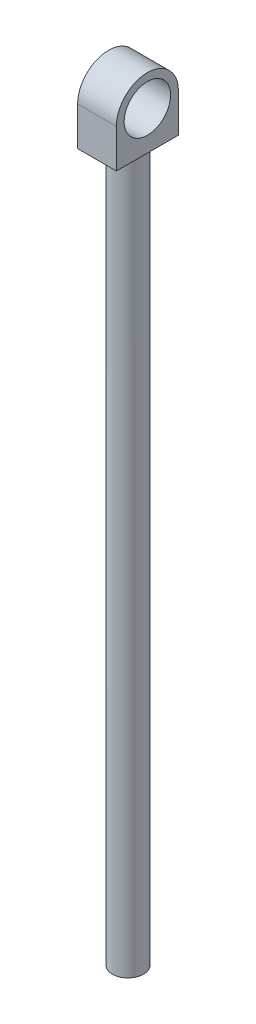
ISO-10303-21;
HEADER;
FILE_DESCRIPTION(('STEP AP214'),'2;1');
FILE_NAME('part.step','',(''),(''),'','','');
FILE_SCHEMA(('AUTOMOTIVE_DESIGN { 1 0 10303 214 1 1 1 1 }'));
ENDSEC;
DATA;
#1=APPLICATION_CONTEXT('core data for automotive mechanical design processes');
#2=APPLICATION_PROTOCOL_DEFINITION('international standard','automotive_design',2000,#1);
#3=PRODUCT_CONTEXT('',#1,'mechanical');
#4=PRODUCT('Part','Part','',(#3));
#5=PRODUCT_RELATED_PRODUCT_CATEGORY('part','',(#4));
#6=PRODUCT_DEFINITION_FORMATION('','',#4);
#7=PRODUCT_DEFINITION_CONTEXT('part definition',#1,'design');
#8=PRODUCT_DEFINITION('design','',#6,#7);
#9=PRODUCT_DEFINITION_SHAPE('','',#8);
#10=(LENGTH_UNIT() NAMED_UNIT(*) SI_UNIT(.MILLI.,.METRE.));
#11=(NAMED_UNIT(*) PLANE_ANGLE_UNIT() SI_UNIT($,.RADIAN.));
#12=(NAMED_UNIT(*) SI_UNIT($,.STERADIAN.) SOLID_ANGLE_UNIT());
#13=UNCERTAINTY_MEASURE_WITH_UNIT(LENGTH_MEASURE(1.E-05),#10,'distance_accuracy_value','');
#14=(GEOMETRIC_REPRESENTATION_CONTEXT(3) GLOBAL_UNCERTAINTY_ASSIGNED_CONTEXT((#13)) GLOBAL_UNIT_ASSIGNED_CONTEXT((#10,
#11,#12)) REPRESENTATION_CONTEXT('',''));
#15=CARTESIAN_POINT('',(0.,0.,0.));
#16=DIRECTION('',(0.,0.,1.));
#17=DIRECTION('',(1.,0.,0.));
#18=AXIS2_PLACEMENT_3D('',#15,#16,#17);
#19=CARTESIAN_POINT('',(0.,60.,0.));
#20=DIRECTION('',(0.,-1.,0.));
#21=DIRECTION('',(0.,0.,-1.));
#22=AXIS2_PLACEMENT_3D('',#19,#20,#21);
#23=CYLINDRICAL_SURFACE('',#22,2.);
#24=CARTESIAN_POINT('',(0.,60.,0.));
#25=DIRECTION('',(0.,1.,0.));
#26=DIRECTION('',(0.,0.,1.));
#27=AXIS2_PLACEMENT_3D('',#24,#25,#26);
#28=CIRCLE('',#27,2.);
#29=CARTESIAN_POINT('',(0.,60.,2.));
#30=VERTEX_POINT('',#29);
#31=EDGE_CURVE('E11',#30,#30,#28,.T.);
#32=ORIENTED_EDGE('',*,*,#31,.F.);
#33=EDGE_LOOP('',(#32));
#34=FACE_BOUND('',#33,.T.);
#35=CARTESIAN_POINT('',(0.,-32.,0.));
#36=DIRECTION('',(0.,-1.,0.));
#37=DIRECTION('',(0.,0.,-1.));
#38=AXIS2_PLACEMENT_3D('',#35,#36,#37);
#39=CIRCLE('',#38,2.);
#40=CARTESIAN_POINT('',(0.,-32.,-2.));
#41=VERTEX_POINT('',#40);
#42=EDGE_CURVE('E121',#41,#41,#39,.T.);
#43=ORIENTED_EDGE('',*,*,#42,.F.);
#44=EDGE_LOOP('',(#43));
#45=FACE_BOUND('',#44,.T.);
#46=ADVANCED_FACE('F49',(#34,#45),#23,.T.);
#47=CARTESIAN_POINT('',(2.5,65.,0.));
#48=DIRECTION('',(-1.,0.,0.));
#49=DIRECTION('',(0.,0.,1.));
#50=AXIS2_PLACEMENT_3D('',#47,#48,#49);
#51=CYLINDRICAL_SURFACE('',#50,4.);
#52=CARTESIAN_POINT('',(-2.5,65.,0.));
#53=DIRECTION('',(1.,0.,0.));
#54=DIRECTION('',(0.,0.,-1.));
#55=AXIS2_PLACEMENT_3D('',#52,#53,#54);
#56=CIRCLE('',#55,4.);
#57=CARTESIAN_POINT('',(-2.5,65.,-4.));
#58=VERTEX_POINT('',#57);
#59=CARTESIAN_POINT('',(-2.5,65.,4.));
#60=VERTEX_POINT('',#59);
#61=EDGE_CURVE('E120',#58,#60,#56,.T.);
#62=ORIENTED_EDGE('',*,*,#61,.T.);
#63=DIRECTION('',(-1.,0.,0.));
#64=VECTOR('',#63,1.);
#65=CARTESIAN_POINT('',(2.5,65.,4.));
#66=LINE('',#65,#64);
#67=CARTESIAN_POINT('',(2.5,65.,4.));
#68=VERTEX_POINT('',#67);
#69=EDGE_CURVE('E57',#68,#60,#66,.T.);
#70=ORIENTED_EDGE('',*,*,#69,.F.);
#71=CARTESIAN_POINT('',(2.5,65.,0.));
#72=DIRECTION('',(1.,0.,0.));
#73=DIRECTION('',(0.,0.,-1.));
#74=AXIS2_PLACEMENT_3D('',#71,#72,#73);
#75=CIRCLE('',#74,4.);
#76=CARTESIAN_POINT('',(2.5,65.,-4.));
#77=VERTEX_POINT('',#76);
#78=EDGE_CURVE('E92',#77,#68,#75,.T.);
#79=ORIENTED_EDGE('',*,*,#78,.F.);
#80=DIRECTION('',(-1.,0.,0.));
#81=VECTOR('',#80,1.);
#82=CARTESIAN_POINT('',(2.5,65.,-4.));
#83=LINE('',#82,#81);
#84=EDGE_CURVE('E116',#77,#58,#83,.T.);
#85=ORIENTED_EDGE('',*,*,#84,.T.);
#86=EDGE_LOOP('',(#62,#70,#79,#85));
#87=FACE_BOUND('',#86,.T.);
#88=ADVANCED_FACE('F130',(#87),#51,.T.);
#89=CARTESIAN_POINT('',(2.5,0.,4.));
#90=DIRECTION('',(0.,0.,1.));
#91=DIRECTION('',(1.,0.,0.));
#92=AXIS2_PLACEMENT_3D('',#89,#90,#91);
#93=PLANE('',#92);
#94=DIRECTION('',(0.,1.,0.));
#95=VECTOR('',#94,1.);
#96=CARTESIAN_POINT('',(-2.5,0.,4.));
#97=LINE('',#96,#95);
#98=CARTESIAN_POINT('',(-2.5,60.,4.));
#99=VERTEX_POINT('',#98);
#100=EDGE_CURVE('E103',#99,#60,#97,.T.);
#101=ORIENTED_EDGE('',*,*,#100,.F.);
#102=DIRECTION('',(-1.,0.,0.));
#103=VECTOR('',#102,1.);
#104=CARTESIAN_POINT('',(2.5,60.,4.));
#105=LINE('',#104,#103);
#106=CARTESIAN_POINT('',(2.5,60.,4.));
#107=VERTEX_POINT('',#106);
#108=EDGE_CURVE('E98',#107,#99,#105,.T.);
#109=ORIENTED_EDGE('',*,*,#108,.F.);
#110=DIRECTION('',(0.,1.,0.));
#111=VECTOR('',#110,1.);
#112=CARTESIAN_POINT('',(2.5,0.,4.));
#113=LINE('',#112,#111);
#114=EDGE_CURVE('E101',#107,#68,#113,.T.);
#115=ORIENTED_EDGE('',*,*,#114,.T.);
#116=ORIENTED_EDGE('',*,*,#69,.T.);
#117=EDGE_LOOP('',(#101,#109,#115,#116));
#118=FACE_BOUND('',#117,.T.);
#119=ADVANCED_FACE('F100',(#118),#93,.T.);
#120=CARTESIAN_POINT('',(2.5,60.,0.));
#121=DIRECTION('',(0.,1.,0.));
#122=DIRECTION('',(0.,0.,1.));
#123=AXIS2_PLACEMENT_3D('',#120,#121,#122);
#124=PLANE('',#123);
#125=ORIENTED_EDGE('',*,*,#31,.T.);
#126=EDGE_LOOP('',(#125));
#127=FACE_BOUND('',#126,.T.);
#128=DIRECTION('',(0.,0.,-1.));
#129=VECTOR('',#128,1.);
#130=CARTESIAN_POINT('',(-2.5,60.,0.));
#131=LINE('',#130,#129);
#132=CARTESIAN_POINT('',(-2.5,60.,-4.));
#133=VERTEX_POINT('',#132);
#134=EDGE_CURVE('E81',#99,#133,#131,.T.);
#135=ORIENTED_EDGE('',*,*,#134,.T.);
#136=DIRECTION('',(-1.,0.,0.));
#137=VECTOR('',#136,1.);
#138=CARTESIAN_POINT('',(2.5,60.,-4.));
#139=LINE('',#138,#137);
#140=CARTESIAN_POINT('',(2.5,60.,-4.));
#141=VERTEX_POINT('',#140);
#142=EDGE_CURVE('E104',#141,#133,#139,.T.);
#143=ORIENTED_EDGE('',*,*,#142,.F.);
#144=DIRECTION('',(0.,0.,-1.));
#145=VECTOR('',#144,1.);
#146=CARTESIAN_POINT('',(2.5,60.,0.));
#147=LINE('',#146,#145);
#148=EDGE_CURVE('E106',#107,#141,#147,.T.);
#149=ORIENTED_EDGE('',*,*,#148,.F.);
#150=ORIENTED_EDGE('',*,*,#108,.T.);
#151=EDGE_LOOP('',(#135,#143,#149,#150));
#152=FACE_BOUND('',#151,.T.);
#153=ADVANCED_FACE('F107',(#127,#152),#124,.F.);
#154=CARTESIAN_POINT('',(2.5,65.,0.));
#155=DIRECTION('',(-1.,0.,0.));
#156=DIRECTION('',(0.,0.,1.));
#157=AXIS2_PLACEMENT_3D('',#154,#155,#156);
#158=CYLINDRICAL_SURFACE('',#157,3.);
#159=CARTESIAN_POINT('',(2.5,65.,0.));
#160=DIRECTION('',(1.,0.,0.));
#161=DIRECTION('',(0.,0.,-1.));
#162=AXIS2_PLACEMENT_3D('',#159,#160,#161);
#163=CIRCLE('',#162,3.);
#164=CARTESIAN_POINT('',(2.5,65.,-3.));
#165=VERTEX_POINT('',#164);
#166=EDGE_CURVE('E111',#165,#165,#163,.T.);
#167=ORIENTED_EDGE('',*,*,#166,.T.);
#168=EDGE_LOOP('',(#167));
#169=FACE_BOUND('',#168,.T.);
#170=CARTESIAN_POINT('',(-2.5,65.,0.));
#171=DIRECTION('',(1.,0.,0.));
#172=DIRECTION('',(0.,0.,-1.));
#173=AXIS2_PLACEMENT_3D('',#170,#171,#172);
#174=CIRCLE('',#173,3.);
#175=CARTESIAN_POINT('',(-2.5,65.,-3.));
#176=VERTEX_POINT('',#175);
#177=EDGE_CURVE('E117',#176,#176,#174,.T.);
#178=ORIENTED_EDGE('',*,*,#177,.F.);
#179=EDGE_LOOP('',(#178));
#180=FACE_BOUND('',#179,.T.);
#181=ADVANCED_FACE('F162',(#169,#180),#158,.F.);
#182=CARTESIAN_POINT('',(2.5,0.,-4.));
#183=DIRECTION('',(0.,0.,1.));
#184=DIRECTION('',(1.,0.,0.));
#185=AXIS2_PLACEMENT_3D('',#182,#183,#184);
#186=PLANE('',#185);
#187=DIRECTION('',(0.,1.,0.));
#188=VECTOR('',#187,1.);
#189=CARTESIAN_POINT('',(-2.5,0.,-4.));
#190=LINE('',#189,#188);
#191=EDGE_CURVE('E87',#133,#58,#190,.T.);
#192=ORIENTED_EDGE('',*,*,#191,.T.);
#193=ORIENTED_EDGE('',*,*,#84,.F.);
#194=DIRECTION('',(0.,1.,0.));
#195=VECTOR('',#194,1.);
#196=CARTESIAN_POINT('',(2.5,0.,-4.));
#197=LINE('',#196,#195);
#198=EDGE_CURVE('E65',#141,#77,#197,.T.);
#199=ORIENTED_EDGE('',*,*,#198,.F.);
#200=ORIENTED_EDGE('',*,*,#142,.T.);
#201=EDGE_LOOP('',(#192,#193,#199,#200));
#202=FACE_BOUND('',#201,.T.);
#203=ADVANCED_FACE('F144',(#202),#186,.F.);
#204=CARTESIAN_POINT('',(2.5,0.,0.));
#205=DIRECTION('',(1.,0.,0.));
#206=DIRECTION('',(0.,0.,-1.));
#207=AXIS2_PLACEMENT_3D('',#204,#205,#206);
#208=PLANE('',#207);
#209=ORIENTED_EDGE('',*,*,#166,.F.);
#210=EDGE_LOOP('',(#209));
#211=FACE_BOUND('',#210,.T.);
#212=ORIENTED_EDGE('',*,*,#78,.T.);
#213=ORIENTED_EDGE('',*,*,#114,.F.);
#214=ORIENTED_EDGE('',*,*,#148,.T.);
#215=ORIENTED_EDGE('',*,*,#198,.T.);
#216=EDGE_LOOP('',(#212,#213,#214,#215));
#217=FACE_BOUND('',#216,.T.);
#218=ADVANCED_FACE('F109',(#211,#217),#208,.T.);
#219=CARTESIAN_POINT('',(-2.5,0.,0.));
#220=DIRECTION('',(1.,0.,0.));
#221=DIRECTION('',(0.,0.,-1.));
#222=AXIS2_PLACEMENT_3D('',#219,#220,#221);
#223=PLANE('',#222);
#224=ORIENTED_EDGE('',*,*,#177,.T.);
#225=EDGE_LOOP('',(#224));
#226=FACE_BOUND('',#225,.T.);
#227=ORIENTED_EDGE('',*,*,#61,.F.);
#228=ORIENTED_EDGE('',*,*,#191,.F.);
#229=ORIENTED_EDGE('',*,*,#134,.F.);
#230=ORIENTED_EDGE('',*,*,#100,.T.);
#231=EDGE_LOOP('',(#227,#228,#229,#230));
#232=FACE_BOUND('',#231,.T.);
#233=ADVANCED_FACE('F132',(#226,#232),#223,.F.);
#234=CARTESIAN_POINT('',(0.,-32.,0.));
#235=DIRECTION('',(0.,-1.,0.));
#236=DIRECTION('',(0.,0.,-1.));
#237=AXIS2_PLACEMENT_3D('',#234,#235,#236);
#238=PLANE('',#237);
#239=ORIENTED_EDGE('',*,*,#42,.T.);
#240=EDGE_LOOP('',(#239));
#241=FACE_BOUND('',#240,.T.);
#242=ADVANCED_FACE('F134',(#241),#238,.T.);
#243=CLOSED_SHELL('',(#46,#88,#119,#153,#181,#203,#218,#233,#242));
#244=MANIFOLD_SOLID_BREP('B2',#243);
#245=ADVANCED_BREP_SHAPE_REPRESENTATION('',(#18,#244),#14);
#246=SHAPE_DEFINITION_REPRESENTATION(#9,#245);
ENDSEC;
END-ISO-10303-21;
